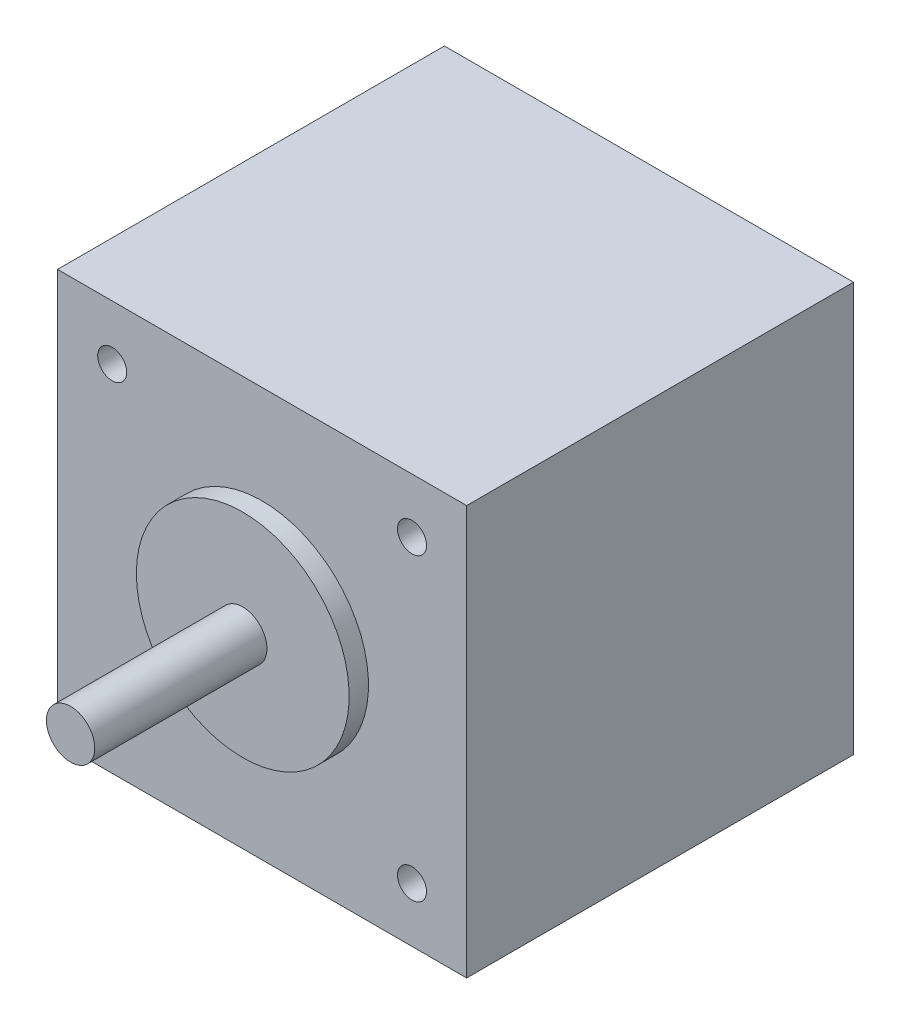
ISO-10303-21;
HEADER;
FILE_DESCRIPTION(('STEP AP214'),'2;1');
FILE_NAME('part.step','',(''),(''),'','','');
FILE_SCHEMA(('AUTOMOTIVE_DESIGN { 1 0 10303 214 1 1 1 1 }'));
ENDSEC;
DATA;
#1=APPLICATION_CONTEXT('core data for automotive mechanical design processes');
#2=APPLICATION_PROTOCOL_DEFINITION('international standard','automotive_design',2000,#1);
#3=PRODUCT_CONTEXT('',#1,'mechanical');
#4=PRODUCT('Part','Part','',(#3));
#5=PRODUCT_RELATED_PRODUCT_CATEGORY('part','',(#4));
#6=PRODUCT_DEFINITION_FORMATION('','',#4);
#7=PRODUCT_DEFINITION_CONTEXT('part definition',#1,'design');
#8=PRODUCT_DEFINITION('design','',#6,#7);
#9=PRODUCT_DEFINITION_SHAPE('','',#8);
#10=(LENGTH_UNIT() NAMED_UNIT(*) SI_UNIT(.MILLI.,.METRE.));
#11=(NAMED_UNIT(*) PLANE_ANGLE_UNIT() SI_UNIT($,.RADIAN.));
#12=(NAMED_UNIT(*) SI_UNIT($,.STERADIAN.) SOLID_ANGLE_UNIT());
#13=UNCERTAINTY_MEASURE_WITH_UNIT(LENGTH_MEASURE(1.E-05),#10,'distance_accuracy_value','');
#14=(GEOMETRIC_REPRESENTATION_CONTEXT(3) GLOBAL_UNCERTAINTY_ASSIGNED_CONTEXT((#13)) GLOBAL_UNIT_ASSIGNED_CONTEXT((#10,
#11,#12)) REPRESENTATION_CONTEXT('',''));
#15=CARTESIAN_POINT('',(0.,0.,0.));
#16=DIRECTION('',(0.,0.,1.));
#17=DIRECTION('',(1.,0.,0.));
#18=AXIS2_PLACEMENT_3D('',#15,#16,#17);
#19=CARTESIAN_POINT('',(21.15,-21.15,40.));
#20=DIRECTION('',(-1.,0.,0.));
#21=DIRECTION('',(0.,0.,1.));
#22=AXIS2_PLACEMENT_3D('',#19,#20,#21);
#23=PLANE('',#22);
#24=DIRECTION('',(0.,1.,0.));
#25=VECTOR('',#24,1.);
#26=CARTESIAN_POINT('',(21.15,-21.15,0.));
#27=LINE('',#26,#25);
#28=CARTESIAN_POINT('',(21.15,-21.15,0.));
#29=VERTEX_POINT('',#28);
#30=CARTESIAN_POINT('',(21.15,21.15,0.));
#31=VERTEX_POINT('',#30);
#32=EDGE_CURVE('E109',#29,#31,#27,.T.);
#33=ORIENTED_EDGE('',*,*,#32,.T.);
#34=DIRECTION('',(0.,0.,-1.));
#35=VECTOR('',#34,1.);
#36=CARTESIAN_POINT('',(21.15,21.15,40.));
#37=LINE('',#36,#35);
#38=CARTESIAN_POINT('',(21.15,21.15,40.));
#39=VERTEX_POINT('',#38);
#40=EDGE_CURVE('E50',#39,#31,#37,.T.);
#41=ORIENTED_EDGE('',*,*,#40,.F.);
#42=DIRECTION('',(0.,1.,0.));
#43=VECTOR('',#42,1.);
#44=CARTESIAN_POINT('',(21.15,-21.15,40.));
#45=LINE('',#44,#43);
#46=CARTESIAN_POINT('',(21.15,-21.15,40.));
#47=VERTEX_POINT('',#46);
#48=EDGE_CURVE('E95',#47,#39,#45,.T.);
#49=ORIENTED_EDGE('',*,*,#48,.F.);
#50=DIRECTION('',(0.,0.,-1.));
#51=VECTOR('',#50,1.);
#52=CARTESIAN_POINT('',(21.15,-21.15,40.));
#53=LINE('',#52,#51);
#54=EDGE_CURVE('E105',#47,#29,#53,.T.);
#55=ORIENTED_EDGE('',*,*,#54,.T.);
#56=EDGE_LOOP('',(#33,#41,#49,#55));
#57=FACE_BOUND('',#56,.T.);
#58=ADVANCED_FACE('F41',(#57),#23,.F.);
#59=CARTESIAN_POINT('',(-21.15,21.15,40.));
#60=DIRECTION('',(0.,-1.,0.));
#61=DIRECTION('',(0.,0.,-1.));
#62=AXIS2_PLACEMENT_3D('',#59,#60,#61);
#63=PLANE('',#62);
#64=DIRECTION('',(-1.,0.,0.));
#65=VECTOR('',#64,1.);
#66=CARTESIAN_POINT('',(-21.15,21.15,0.));
#67=LINE('',#66,#65);
#68=CARTESIAN_POINT('',(-21.15,21.15,0.));
#69=VERTEX_POINT('',#68);
#70=EDGE_CURVE('E100',#31,#69,#67,.T.);
#71=ORIENTED_EDGE('',*,*,#70,.T.);
#72=DIRECTION('',(0.,0.,-1.));
#73=VECTOR('',#72,1.);
#74=CARTESIAN_POINT('',(-21.15,21.15,40.));
#75=LINE('',#74,#73);
#76=CARTESIAN_POINT('',(-21.15,21.15,40.));
#77=VERTEX_POINT('',#76);
#78=EDGE_CURVE('E98',#77,#69,#75,.T.);
#79=ORIENTED_EDGE('',*,*,#78,.F.);
#80=DIRECTION('',(-1.,0.,0.));
#81=VECTOR('',#80,1.);
#82=CARTESIAN_POINT('',(-21.15,21.15,40.));
#83=LINE('',#82,#81);
#84=EDGE_CURVE('E90',#39,#77,#83,.T.);
#85=ORIENTED_EDGE('',*,*,#84,.F.);
#86=ORIENTED_EDGE('',*,*,#40,.T.);
#87=EDGE_LOOP('',(#71,#79,#85,#86));
#88=FACE_BOUND('',#87,.T.);
#89=ADVANCED_FACE('F99',(#88),#63,.F.);
#90=CARTESIAN_POINT('',(-21.15,-21.15,40.));
#91=DIRECTION('',(1.,0.,0.));
#92=DIRECTION('',(0.,0.,-1.));
#93=AXIS2_PLACEMENT_3D('',#90,#91,#92);
#94=PLANE('',#93);
#95=DIRECTION('',(0.,-1.,0.));
#96=VECTOR('',#95,1.);
#97=CARTESIAN_POINT('',(-21.15,-21.15,0.));
#98=LINE('',#97,#96);
#99=CARTESIAN_POINT('',(-21.15,-21.15,0.));
#100=VERTEX_POINT('',#99);
#101=EDGE_CURVE('E76',#69,#100,#98,.T.);
#102=ORIENTED_EDGE('',*,*,#101,.T.);
#103=DIRECTION('',(0.,0.,-1.));
#104=VECTOR('',#103,1.);
#105=CARTESIAN_POINT('',(-21.15,-21.15,40.));
#106=LINE('',#105,#104);
#107=CARTESIAN_POINT('',(-21.15,-21.15,40.));
#108=VERTEX_POINT('',#107);
#109=EDGE_CURVE('E101',#108,#100,#106,.T.);
#110=ORIENTED_EDGE('',*,*,#109,.F.);
#111=DIRECTION('',(0.,-1.,0.));
#112=VECTOR('',#111,1.);
#113=CARTESIAN_POINT('',(-21.15,-21.15,40.));
#114=LINE('',#113,#112);
#115=EDGE_CURVE('E93',#77,#108,#114,.T.);
#116=ORIENTED_EDGE('',*,*,#115,.F.);
#117=ORIENTED_EDGE('',*,*,#78,.T.);
#118=EDGE_LOOP('',(#102,#110,#116,#117));
#119=FACE_BOUND('',#118,.T.);
#120=ADVANCED_FACE('F103',(#119),#94,.F.);
#121=CARTESIAN_POINT('',(-21.15,-21.15,40.));
#122=DIRECTION('',(0.,1.,0.));
#123=DIRECTION('',(0.,0.,1.));
#124=AXIS2_PLACEMENT_3D('',#121,#122,#123);
#125=PLANE('',#124);
#126=DIRECTION('',(1.,0.,0.));
#127=VECTOR('',#126,1.);
#128=CARTESIAN_POINT('',(-21.15,-21.15,0.));
#129=LINE('',#128,#127);
#130=EDGE_CURVE('E82',#100,#29,#129,.T.);
#131=ORIENTED_EDGE('',*,*,#130,.T.);
#132=ORIENTED_EDGE('',*,*,#54,.F.);
#133=DIRECTION('',(1.,0.,0.));
#134=VECTOR('',#133,1.);
#135=CARTESIAN_POINT('',(-21.15,-21.15,40.));
#136=LINE('',#135,#134);
#137=EDGE_CURVE('E59',#108,#47,#136,.T.);
#138=ORIENTED_EDGE('',*,*,#137,.F.);
#139=ORIENTED_EDGE('',*,*,#109,.T.);
#140=EDGE_LOOP('',(#131,#132,#138,#139));
#141=FACE_BOUND('',#140,.T.);
#142=ADVANCED_FACE('F132',(#141),#125,.F.);
#143=CARTESIAN_POINT('',(0.,0.,40.));
#144=DIRECTION('',(0.,0.,-1.));
#145=DIRECTION('',(-1.,0.,0.));
#146=AXIS2_PLACEMENT_3D('',#143,#144,#145);
#147=PLANE('',#146);
#148=CARTESIAN_POINT('',(-15.5,15.5,40.));
#149=DIRECTION('',(0.,0.,1.));
#150=DIRECTION('',(1.,0.,0.));
#151=AXIS2_PLACEMENT_3D('',#148,#149,#150);
#152=CIRCLE('',#151,1.5);
#153=CARTESIAN_POINT('',(-14.,15.5,40.));
#154=VERTEX_POINT('',#153);
#155=EDGE_CURVE('E281',#154,#154,#152,.T.);
#156=ORIENTED_EDGE('',*,*,#155,.F.);
#157=EDGE_LOOP('',(#156));
#158=FACE_BOUND('',#157,.T.);
#159=CARTESIAN_POINT('',(15.5,-15.5,40.));
#160=DIRECTION('',(0.,0.,1.));
#161=DIRECTION('',(1.,0.,0.));
#162=AXIS2_PLACEMENT_3D('',#159,#160,#161);
#163=CIRCLE('',#162,1.5);
#164=CARTESIAN_POINT('',(17.,-15.5,40.));
#165=VERTEX_POINT('',#164);
#166=EDGE_CURVE('E287',#165,#165,#163,.T.);
#167=ORIENTED_EDGE('',*,*,#166,.F.);
#168=EDGE_LOOP('',(#167));
#169=FACE_BOUND('',#168,.T.);
#170=CARTESIAN_POINT('',(15.5,15.5,40.));
#171=DIRECTION('',(0.,0.,1.));
#172=DIRECTION('',(1.,0.,0.));
#173=AXIS2_PLACEMENT_3D('',#170,#171,#172);
#174=CIRCLE('',#173,1.5);
#175=CARTESIAN_POINT('',(17.,15.5,40.));
#176=VERTEX_POINT('',#175);
#177=EDGE_CURVE('E288',#176,#176,#174,.T.);
#178=ORIENTED_EDGE('',*,*,#177,.F.);
#179=EDGE_LOOP('',(#178));
#180=FACE_BOUND('',#179,.T.);
#181=CARTESIAN_POINT('',(-15.5,-15.5,40.));
#182=DIRECTION('',(0.,0.,1.));
#183=DIRECTION('',(1.,0.,0.));
#184=AXIS2_PLACEMENT_3D('',#181,#182,#183);
#185=CIRCLE('',#184,1.5);
#186=CARTESIAN_POINT('',(-14.,-15.5,40.));
#187=VERTEX_POINT('',#186);
#188=EDGE_CURVE('E278',#187,#187,#185,.T.);
#189=ORIENTED_EDGE('',*,*,#188,.F.);
#190=EDGE_LOOP('',(#189));
#191=FACE_BOUND('',#190,.T.);
#192=CARTESIAN_POINT('',(0.,0.,40.));
#193=DIRECTION('',(0.,0.,-1.));
#194=DIRECTION('',(-1.,0.,0.));
#195=AXIS2_PLACEMENT_3D('',#192,#193,#194);
#196=CIRCLE('',#195,11.);
#197=CARTESIAN_POINT('',(-11.,0.,40.));
#198=VERTEX_POINT('',#197);
#199=EDGE_CURVE('E11',#198,#198,#196,.F.);
#200=ORIENTED_EDGE('',*,*,#199,.F.);
#201=EDGE_LOOP('',(#200));
#202=FACE_BOUND('',#201,.T.);
#203=ORIENTED_EDGE('',*,*,#48,.T.);
#204=ORIENTED_EDGE('',*,*,#84,.T.);
#205=ORIENTED_EDGE('',*,*,#115,.T.);
#206=ORIENTED_EDGE('',*,*,#137,.T.);
#207=EDGE_LOOP('',(#203,#204,#205,#206));
#208=FACE_BOUND('',#207,.T.);
#209=ADVANCED_FACE('F91',(#158,#169,#180,#191,#202,#208),#147,.F.);
#210=CARTESIAN_POINT('',(0.,0.,0.));
#211=DIRECTION('',(0.,0.,-1.));
#212=DIRECTION('',(-1.,0.,0.));
#213=AXIS2_PLACEMENT_3D('',#210,#211,#212);
#214=PLANE('',#213);
#215=ORIENTED_EDGE('',*,*,#32,.F.);
#216=ORIENTED_EDGE('',*,*,#130,.F.);
#217=ORIENTED_EDGE('',*,*,#101,.F.);
#218=ORIENTED_EDGE('',*,*,#70,.F.);
#219=EDGE_LOOP('',(#215,#216,#217,#218));
#220=FACE_BOUND('',#219,.T.);
#221=ADVANCED_FACE('F120',(#220),#214,.T.);
#222=CARTESIAN_POINT('',(0.,0.,42.));
#223=DIRECTION('',(0.,0.,-1.));
#224=DIRECTION('',(-1.,0.,0.));
#225=AXIS2_PLACEMENT_3D('',#222,#223,#224);
#226=CYLINDRICAL_SURFACE('',#225,11.);
#227=CARTESIAN_POINT('',(0.,0.,42.));
#228=DIRECTION('',(0.,0.,1.));
#229=DIRECTION('',(1.,0.,0.));
#230=AXIS2_PLACEMENT_3D('',#227,#228,#229);
#231=CIRCLE('',#230,11.);
#232=CARTESIAN_POINT('',(-11.,0.,42.));
#233=VERTEX_POINT('',#232);
#234=EDGE_CURVE('E273',#233,#233,#231,.T.);
#235=CARTESIAN_POINT('',(-11.,0.,42.));
#236=CARTESIAN_POINT('',(-11.,0.,41.9791666666667));
#237=CARTESIAN_POINT('',(-11.,0.,41.9583333333333));
#238=CARTESIAN_POINT('',(-11.,0.,41.9166666666667));
#239=CARTESIAN_POINT('',(-11.,0.,41.8958333333333));
#240=CARTESIAN_POINT('',(-11.,0.,41.8541666666667));
#241=CARTESIAN_POINT('',(-11.,0.,41.8333333333333));
#242=CARTESIAN_POINT('',(-11.,0.,41.7916666666667));
#243=CARTESIAN_POINT('',(-11.,0.,41.7708333333333));
#244=CARTESIAN_POINT('',(-11.,0.,41.7291666666667));
#245=CARTESIAN_POINT('',(-11.,0.,41.7083333333333));
#246=CARTESIAN_POINT('',(-11.,0.,41.6666666666667));
#247=CARTESIAN_POINT('',(-11.,0.,41.6458333333333));
#248=CARTESIAN_POINT('',(-11.,0.,41.6041666666667));
#249=CARTESIAN_POINT('',(-11.,0.,41.5833333333333));
#250=CARTESIAN_POINT('',(-11.,0.,41.5416666666667));
#251=CARTESIAN_POINT('',(-11.,0.,41.5208333333333));
#252=CARTESIAN_POINT('',(-11.,0.,41.4791666666667));
#253=CARTESIAN_POINT('',(-11.,0.,41.4583333333333));
#254=CARTESIAN_POINT('',(-11.,0.,41.4166666666667));
#255=CARTESIAN_POINT('',(-11.,0.,41.3958333333333));
#256=CARTESIAN_POINT('',(-11.,0.,41.3541666666667));
#257=CARTESIAN_POINT('',(-11.,0.,41.3333333333333));
#258=CARTESIAN_POINT('',(-11.,0.,41.2916666666667));
#259=CARTESIAN_POINT('',(-11.,0.,41.2708333333333));
#260=CARTESIAN_POINT('',(-11.,0.,41.2291666666667));
#261=CARTESIAN_POINT('',(-11.,0.,41.2083333333333));
#262=CARTESIAN_POINT('',(-11.,0.,41.1666666666667));
#263=CARTESIAN_POINT('',(-11.,0.,41.1458333333333));
#264=CARTESIAN_POINT('',(-11.,0.,41.1041666666667));
#265=CARTESIAN_POINT('',(-11.,0.,41.0833333333333));
#266=CARTESIAN_POINT('',(-11.,0.,41.0416666666667));
#267=CARTESIAN_POINT('',(-11.,0.,41.0208333333333));
#268=CARTESIAN_POINT('',(-11.,0.,40.9791666666667));
#269=CARTESIAN_POINT('',(-11.,0.,40.9583333333333));
#270=CARTESIAN_POINT('',(-11.,0.,40.9166666666667));
#271=CARTESIAN_POINT('',(-11.,0.,40.8958333333333));
#272=CARTESIAN_POINT('',(-11.,0.,40.8541666666667));
#273=CARTESIAN_POINT('',(-11.,0.,40.8333333333333));
#274=CARTESIAN_POINT('',(-11.,0.,40.7916666666667));
#275=CARTESIAN_POINT('',(-11.,0.,40.7708333333333));
#276=CARTESIAN_POINT('',(-11.,0.,40.7291666666667));
#277=CARTESIAN_POINT('',(-11.,0.,40.7083333333333));
#278=CARTESIAN_POINT('',(-11.,0.,40.6666666666667));
#279=CARTESIAN_POINT('',(-11.,0.,40.6458333333333));
#280=CARTESIAN_POINT('',(-11.,0.,40.6041666666667));
#281=CARTESIAN_POINT('',(-11.,0.,40.5833333333333));
#282=CARTESIAN_POINT('',(-11.,0.,40.5416666666667));
#283=CARTESIAN_POINT('',(-11.,0.,40.5208333333333));
#284=CARTESIAN_POINT('',(-11.,0.,40.4791666666667));
#285=CARTESIAN_POINT('',(-11.,0.,40.4583333333333));
#286=CARTESIAN_POINT('',(-11.,0.,40.4166666666667));
#287=CARTESIAN_POINT('',(-11.,0.,40.3958333333333));
#288=CARTESIAN_POINT('',(-11.,0.,40.3541666666667));
#289=CARTESIAN_POINT('',(-11.,0.,40.3333333333333));
#290=CARTESIAN_POINT('',(-11.,0.,40.2916666666667));
#291=CARTESIAN_POINT('',(-11.,0.,40.2708333333333));
#292=CARTESIAN_POINT('',(-11.,0.,40.2291666666667));
#293=CARTESIAN_POINT('',(-11.,0.,40.2083333333333));
#294=CARTESIAN_POINT('',(-11.,0.,40.1666666666667));
#295=CARTESIAN_POINT('',(-11.,0.,40.1458333333333));
#296=CARTESIAN_POINT('',(-11.,0.,40.1041666666667));
#297=CARTESIAN_POINT('',(-11.,0.,40.0833333333333));
#298=CARTESIAN_POINT('',(-11.,0.,40.0416666666667));
#299=CARTESIAN_POINT('',(-11.,0.,40.0208333333333));
#300=CARTESIAN_POINT('',(-11.,0.,40.));
#301=B_SPLINE_CURVE_WITH_KNOTS('',3,(#235,#236,#237,#238,#239,#240,#241,#242,#243,#244,#245,
#246,#247,#248,#249,#250,#251,#252,#253,#254,#255,#256,#257,#258,#259,#260,#261,#262,#263,#264,
#265,#266,#267,#268,#269,#270,#271,#272,#273,#274,#275,#276,#277,#278,#279,#280,#281,#282,#283,
#284,#285,#286,#287,#288,#289,#290,#291,#292,#293,#294,#295,#296,#297,#298,#299,#300),
.UNSPECIFIED.,.F.,.F.,(4,2,2,2,2,2,2,2,2,2,2,2,2,2,2,2,2,2,2,2,2,2,2,2,2,2,2,2,2,2,2,2,4),(0.,
0.0624999999999931,0.124999999999993,0.187499999999993,0.249999999999993,0.312499999999993,
0.374999999999993,0.437499999999993,0.499999999999994,0.562499999999994,0.624999999999994,
0.687499999999994,0.749999999999994,0.812499999999994,0.874999999999994,0.937499999999994,
0.999999999999994,1.06249999999999,1.12499999999999,1.18749999999999,1.24999999999999,
1.31249999999999,1.37499999999999,1.43749999999999,1.49999999999999,1.56249999999999,
1.62499999999999,1.68749999999999,1.74999999999999,1.81249999999999,1.87499999999999,
1.93749999999999,1.99999999999999),.UNSPECIFIED.);
#302=EDGE_CURVE('BSEAM122',#233,#198,#301,.T.);
#303=ORIENTED_EDGE('',*,*,#234,.F.);
#304=ORIENTED_EDGE('',*,*,#199,.T.);
#305=ORIENTED_EDGE('',*,*,#302,.T.);
#306=ORIENTED_EDGE('',*,*,#302,.F.);
#307=EDGE_LOOP('',(#303,#305,#304,#306));
#308=FACE_BOUND('',#307,.T.);
#309=ADVANCED_FACE('F122',(#308),#226,.T.);
#310=CARTESIAN_POINT('',(0.,0.,42.));
#311=DIRECTION('',(0.,0.,1.));
#312=DIRECTION('',(1.,0.,0.));
#313=AXIS2_PLACEMENT_3D('',#310,#311,#312);
#314=PLANE('',#313);
#315=CARTESIAN_POINT('',(0.,0.,42.));
#316=DIRECTION('',(0.,0.,1.));
#317=DIRECTION('',(1.,0.,0.));
#318=AXIS2_PLACEMENT_3D('',#315,#316,#317);
#319=CIRCLE('',#318,2.5);
#320=CARTESIAN_POINT('',(2.5,0.,42.));
#321=VERTEX_POINT('',#320);
#322=EDGE_CURVE('E44',#321,#321,#319,.T.);
#323=ORIENTED_EDGE('',*,*,#322,.F.);
#324=EDGE_LOOP('',(#323));
#325=FACE_BOUND('',#324,.T.);
#326=ORIENTED_EDGE('',*,*,#234,.T.);
#327=EDGE_LOOP('',(#326));
#328=FACE_BOUND('',#327,.T.);
#329=ADVANCED_FACE('F128',(#325,#328),#314,.T.);
#330=CARTESIAN_POINT('',(0.,0.,59.8));
#331=DIRECTION('',(0.,0.,1.));
#332=DIRECTION('',(1.,0.,0.));
#333=AXIS2_PLACEMENT_3D('',#330,#331,#332);
#334=PLANE('',#333);
#335=CARTESIAN_POINT('',(0.,0.,59.8));
#336=DIRECTION('',(0.,0.,1.));
#337=DIRECTION('',(1.,0.,0.));
#338=AXIS2_PLACEMENT_3D('',#335,#336,#337);
#339=CIRCLE('',#338,2.5);
#340=CARTESIAN_POINT('',(2.5,0.,59.8));
#341=VERTEX_POINT('',#340);
#342=EDGE_CURVE('E112',#341,#341,#339,.T.);
#343=ORIENTED_EDGE('',*,*,#342,.T.);
#344=EDGE_LOOP('',(#343));
#345=FACE_BOUND('',#344,.T.);
#346=ADVANCED_FACE('F153',(#345),#334,.T.);
#347=CARTESIAN_POINT('',(0.,0.,59.8));
#348=DIRECTION('',(0.,0.,-1.));
#349=DIRECTION('',(-1.,0.,0.));
#350=AXIS2_PLACEMENT_3D('',#347,#348,#349);
#351=CYLINDRICAL_SURFACE('',#350,2.5);
#352=ORIENTED_EDGE('',*,*,#322,.T.);
#353=EDGE_LOOP('',(#352));
#354=FACE_BOUND('',#353,.T.);
#355=ORIENTED_EDGE('',*,*,#342,.F.);
#356=EDGE_LOOP('',(#355));
#357=FACE_BOUND('',#356,.T.);
#358=ADVANCED_FACE('F156',(#354,#357),#351,.T.);
#359=CARTESIAN_POINT('',(-15.5,-15.5,35.5));
#360=DIRECTION('',(0.,0.,1.));
#361=DIRECTION('',(1.,0.,0.));
#362=AXIS2_PLACEMENT_3D('',#359,#360,#361);
#363=CYLINDRICAL_SURFACE('',#362,1.5);
#364=CARTESIAN_POINT('',(-15.5,-15.5,35.5));
#365=DIRECTION('',(0.,0.,1.));
#366=DIRECTION('',(1.,0.,0.));
#367=AXIS2_PLACEMENT_3D('',#364,#365,#366);
#368=CIRCLE('',#367,1.5);
#369=CARTESIAN_POINT('',(-14.,-15.5,35.5));
#370=VERTEX_POINT('',#369);
#371=EDGE_CURVE('E277',#370,#370,#368,.T.);
#372=ORIENTED_EDGE('',*,*,#371,.F.);
#373=EDGE_LOOP('',(#372));
#374=FACE_BOUND('',#373,.T.);
#375=ORIENTED_EDGE('',*,*,#188,.T.);
#376=EDGE_LOOP('',(#375));
#377=FACE_BOUND('',#376,.T.);
#378=ADVANCED_FACE('F185',(#374,#377),#363,.F.);
#379=CARTESIAN_POINT('',(-15.5,-15.5,35.5));
#380=DIRECTION('',(0.,0.,1.));
#381=DIRECTION('',(1.,0.,0.));
#382=AXIS2_PLACEMENT_3D('',#379,#380,#381);
#383=PLANE('',#382);
#384=ORIENTED_EDGE('',*,*,#371,.T.);
#385=EDGE_LOOP('',(#384));
#386=FACE_BOUND('',#385,.T.);
#387=ADVANCED_FACE('F190',(#386),#383,.T.);
#388=CARTESIAN_POINT('',(15.5,15.5,35.5));
#389=DIRECTION('',(0.,0.,1.));
#390=DIRECTION('',(1.,0.,0.));
#391=AXIS2_PLACEMENT_3D('',#388,#389,#390);
#392=CYLINDRICAL_SURFACE('',#391,1.5);
#393=CARTESIAN_POINT('',(15.5,15.5,35.5));
#394=DIRECTION('',(0.,0.,1.));
#395=DIRECTION('',(1.,0.,0.));
#396=AXIS2_PLACEMENT_3D('',#393,#394,#395);
#397=CIRCLE('',#396,1.5);
#398=CARTESIAN_POINT('',(17.,15.5,35.5));
#399=VERTEX_POINT('',#398);
#400=EDGE_CURVE('E295',#399,#399,#397,.T.);
#401=ORIENTED_EDGE('',*,*,#400,.F.);
#402=EDGE_LOOP('',(#401));
#403=FACE_BOUND('',#402,.T.);
#404=ORIENTED_EDGE('',*,*,#177,.T.);
#405=EDGE_LOOP('',(#404));
#406=FACE_BOUND('',#405,.T.);
#407=ADVANCED_FACE('F200',(#403,#406),#392,.F.);
#408=CARTESIAN_POINT('',(15.5,15.5,35.5));
#409=DIRECTION('',(0.,0.,1.));
#410=DIRECTION('',(1.,0.,0.));
#411=AXIS2_PLACEMENT_3D('',#408,#409,#410);
#412=PLANE('',#411);
#413=ORIENTED_EDGE('',*,*,#400,.T.);
#414=EDGE_LOOP('',(#413));
#415=FACE_BOUND('',#414,.T.);
#416=ADVANCED_FACE('F210',(#415),#412,.T.);
#417=CARTESIAN_POINT('',(15.5,-15.5,35.5));
#418=DIRECTION('',(0.,0.,1.));
#419=DIRECTION('',(1.,0.,0.));
#420=AXIS2_PLACEMENT_3D('',#417,#418,#419);
#421=CYLINDRICAL_SURFACE('',#420,1.5);
#422=CARTESIAN_POINT('',(15.5,-15.5,35.5));
#423=DIRECTION('',(0.,0.,1.));
#424=DIRECTION('',(1.,0.,0.));
#425=AXIS2_PLACEMENT_3D('',#422,#423,#424);
#426=CIRCLE('',#425,1.5);
#427=CARTESIAN_POINT('',(17.,-15.5,35.5));
#428=VERTEX_POINT('',#427);
#429=EDGE_CURVE('E284',#428,#428,#426,.T.);
#430=ORIENTED_EDGE('',*,*,#429,.F.);
#431=EDGE_LOOP('',(#430));
#432=FACE_BOUND('',#431,.T.);
#433=ORIENTED_EDGE('',*,*,#166,.T.);
#434=EDGE_LOOP('',(#433));
#435=FACE_BOUND('',#434,.T.);
#436=ADVANCED_FACE('F220',(#432,#435),#421,.F.);
#437=CARTESIAN_POINT('',(15.5,-15.5,35.5));
#438=DIRECTION('',(0.,0.,1.));
#439=DIRECTION('',(1.,0.,0.));
#440=AXIS2_PLACEMENT_3D('',#437,#438,#439);
#441=PLANE('',#440);
#442=ORIENTED_EDGE('',*,*,#429,.T.);
#443=EDGE_LOOP('',(#442));
#444=FACE_BOUND('',#443,.T.);
#445=ADVANCED_FACE('F230',(#444),#441,.T.);
#446=CARTESIAN_POINT('',(-15.5,15.5,35.5));
#447=DIRECTION('',(0.,0.,1.));
#448=DIRECTION('',(1.,0.,0.));
#449=AXIS2_PLACEMENT_3D('',#446,#447,#448);
#450=CYLINDRICAL_SURFACE('',#449,1.5);
#451=CARTESIAN_POINT('',(-15.5,15.5,35.5));
#452=DIRECTION('',(0.,0.,1.));
#453=DIRECTION('',(1.,0.,0.));
#454=AXIS2_PLACEMENT_3D('',#451,#452,#453);
#455=CIRCLE('',#454,1.5);
#456=CARTESIAN_POINT('',(-14.,15.5,35.5));
#457=VERTEX_POINT('',#456);
#458=EDGE_CURVE('E291',#457,#457,#455,.T.);
#459=ORIENTED_EDGE('',*,*,#458,.F.);
#460=EDGE_LOOP('',(#459));
#461=FACE_BOUND('',#460,.T.);
#462=ORIENTED_EDGE('',*,*,#155,.T.);
#463=EDGE_LOOP('',(#462));
#464=FACE_BOUND('',#463,.T.);
#465=ADVANCED_FACE('F240',(#461,#464),#450,.F.);
#466=CARTESIAN_POINT('',(-15.5,15.5,35.5));
#467=DIRECTION('',(0.,0.,1.));
#468=DIRECTION('',(1.,0.,0.));
#469=AXIS2_PLACEMENT_3D('',#466,#467,#468);
#470=PLANE('',#469);
#471=ORIENTED_EDGE('',*,*,#458,.T.);
#472=EDGE_LOOP('',(#471));
#473=FACE_BOUND('',#472,.T.);
#474=ADVANCED_FACE('F250',(#473),#470,.T.);
#475=CLOSED_SHELL('',(#58,#89,#120,#142,#209,#221,#309,#329,#346,#358,#378,#387,#407,#416,#436,
#445,#465,#474));
#476=MANIFOLD_SOLID_BREP('B2',#475);
#477=ADVANCED_BREP_SHAPE_REPRESENTATION('',(#18,#476),#14);
#478=SHAPE_DEFINITION_REPRESENTATION(#9,#477);
ENDSEC;
END-ISO-10303-21;
